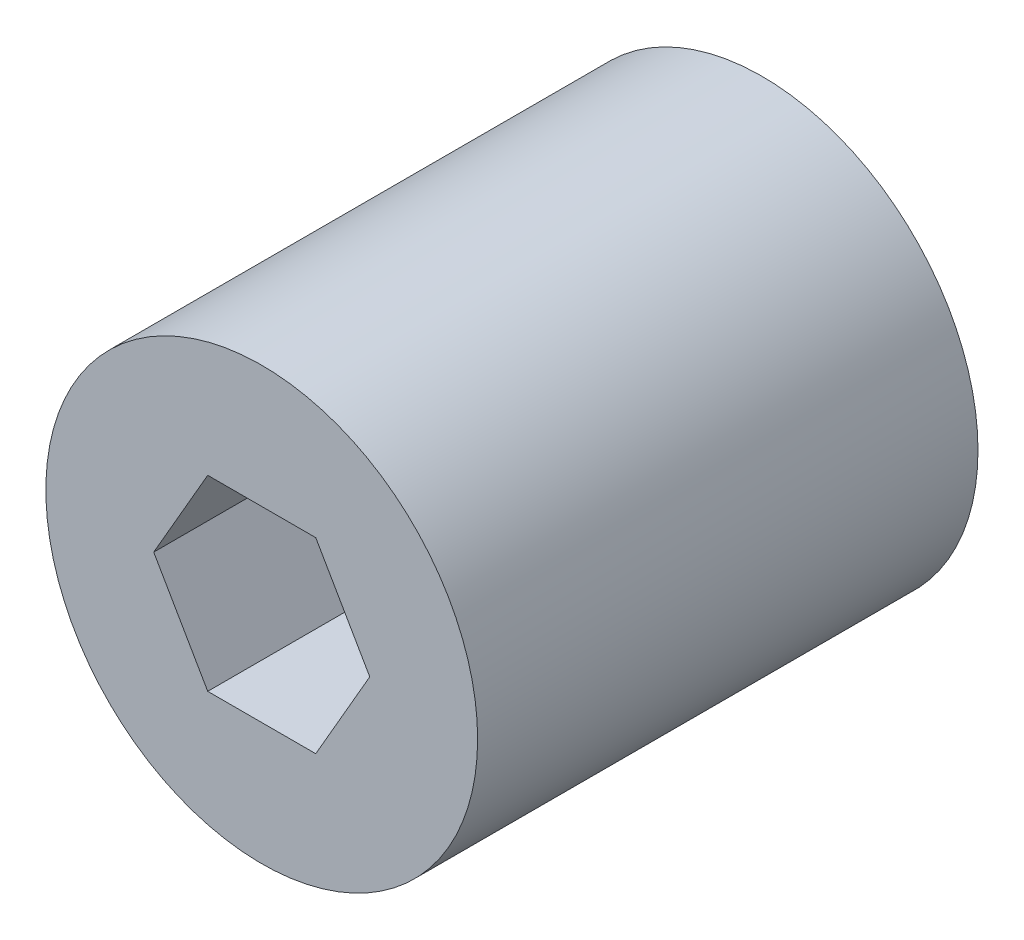
ISO-10303-21;
HEADER;
FILE_DESCRIPTION(('STEP AP214'),'2;1');
FILE_NAME('part.step','',(''),(''),'','','');
FILE_SCHEMA(('AUTOMOTIVE_DESIGN { 1 0 10303 214 1 1 1 1 }'));
ENDSEC;
DATA;
#1=APPLICATION_CONTEXT('core data for automotive mechanical design processes');
#2=APPLICATION_PROTOCOL_DEFINITION('international standard','automotive_design',2000,#1);
#3=PRODUCT_CONTEXT('',#1,'mechanical');
#4=PRODUCT('Part','Part','',(#3));
#5=PRODUCT_RELATED_PRODUCT_CATEGORY('part','',(#4));
#6=PRODUCT_DEFINITION_FORMATION('','',#4);
#7=PRODUCT_DEFINITION_CONTEXT('part definition',#1,'design');
#8=PRODUCT_DEFINITION('design','',#6,#7);
#9=PRODUCT_DEFINITION_SHAPE('','',#8);
#10=(LENGTH_UNIT() NAMED_UNIT(*) SI_UNIT(.MILLI.,.METRE.));
#11=(NAMED_UNIT(*) PLANE_ANGLE_UNIT() SI_UNIT($,.RADIAN.));
#12=(NAMED_UNIT(*) SI_UNIT($,.STERADIAN.) SOLID_ANGLE_UNIT());
#13=UNCERTAINTY_MEASURE_WITH_UNIT(LENGTH_MEASURE(1.E-05),#10,'distance_accuracy_value','');
#14=(GEOMETRIC_REPRESENTATION_CONTEXT(3) GLOBAL_UNCERTAINTY_ASSIGNED_CONTEXT((#13)) GLOBAL_UNIT_ASSIGNED_CONTEXT((#10,
#11,#12)) REPRESENTATION_CONTEXT('',''));
#15=CARTESIAN_POINT('',(0.,0.,0.));
#16=DIRECTION('',(0.,0.,1.));
#17=DIRECTION('',(1.,0.,0.));
#18=AXIS2_PLACEMENT_3D('',#15,#16,#17);
#19=CARTESIAN_POINT('',(0.,0.,13.90575));
#20=DIRECTION('',(0.,0.,1.));
#21=DIRECTION('',(1.,0.,0.));
#22=AXIS2_PLACEMENT_3D('',#19,#20,#21);
#23=PLANE('',#22);
#24=CARTESIAN_POINT('',(0.,0.,13.90575));
#25=DIRECTION('',(0.,0.,1.));
#26=DIRECTION('',(1.,0.,0.));
#27=AXIS2_PLACEMENT_3D('',#24,#25,#26);
#28=CIRCLE('',#27,6.);
#29=CARTESIAN_POINT('',(6.,0.,13.90575));
#30=VERTEX_POINT('',#29);
#31=EDGE_CURVE('E11',#30,#30,#28,.T.);
#32=ORIENTED_EDGE('',*,*,#31,.T.);
#33=EDGE_LOOP('',(#32));
#34=FACE_BOUND('',#33,.T.);
#35=DIRECTION('',(-0.5,0.866025403784439,0.));
#36=VECTOR('',#35,1.);
#37=CARTESIAN_POINT('',(3.00222139978606,0.,13.90575));
#38=LINE('',#37,#36);
#39=CARTESIAN_POINT('',(3.00222139978606,0.,13.90575));
#40=VERTEX_POINT('',#39);
#41=CARTESIAN_POINT('',(1.50111069989303,2.6,13.90575));
#42=VERTEX_POINT('',#41);
#43=EDGE_CURVE('E95',#40,#42,#38,.T.);
#44=ORIENTED_EDGE('',*,*,#43,.F.);
#45=DIRECTION('',(0.5,0.866025403784439,0.));
#46=VECTOR('',#45,1.);
#47=CARTESIAN_POINT('',(1.50111069989303,-2.6,13.90575));
#48=LINE('',#47,#46);
#49=CARTESIAN_POINT('',(1.50111069989303,-2.6,13.90575));
#50=VERTEX_POINT('',#49);
#51=EDGE_CURVE('E87',#50,#40,#48,.T.);
#52=ORIENTED_EDGE('',*,*,#51,.F.);
#53=DIRECTION('',(1.,0.,0.));
#54=VECTOR('',#53,1.);
#55=CARTESIAN_POINT('',(-1.50111069989303,-2.6,13.90575));
#56=LINE('',#55,#54);
#57=CARTESIAN_POINT('',(-1.50111069989303,-2.6,13.90575));
#58=VERTEX_POINT('',#57);
#59=EDGE_CURVE('E115',#58,#50,#56,.T.);
#60=ORIENTED_EDGE('',*,*,#59,.F.);
#61=DIRECTION('',(0.5,-0.866025403784439,0.));
#62=VECTOR('',#61,1.);
#63=CARTESIAN_POINT('',(-3.00222139978606,0.,13.90575));
#64=LINE('',#63,#62);
#65=CARTESIAN_POINT('',(-3.00222139978606,0.,13.90575));
#66=VERTEX_POINT('',#65);
#67=EDGE_CURVE('E113',#66,#58,#64,.T.);
#68=ORIENTED_EDGE('',*,*,#67,.F.);
#69=DIRECTION('',(-0.5,-0.866025403784439,0.));
#70=VECTOR('',#69,1.);
#71=CARTESIAN_POINT('',(-1.50111069989303,2.6,13.90575));
#72=LINE('',#71,#70);
#73=CARTESIAN_POINT('',(-1.50111069989303,2.6,13.90575));
#74=VERTEX_POINT('',#73);
#75=EDGE_CURVE('E109',#74,#66,#72,.T.);
#76=ORIENTED_EDGE('',*,*,#75,.F.);
#77=DIRECTION('',(-1.,0.,0.));
#78=VECTOR('',#77,1.);
#79=CARTESIAN_POINT('',(1.50111069989303,2.6,13.90575));
#80=LINE('',#79,#78);
#81=EDGE_CURVE('E107',#42,#74,#80,.T.);
#82=ORIENTED_EDGE('',*,*,#81,.F.);
#83=EDGE_LOOP('',(#44,#52,#60,#68,#76,#82));
#84=FACE_BOUND('',#83,.T.);
#85=ADVANCED_FACE('F34',(#34,#84),#23,.T.);
#86=CARTESIAN_POINT('',(0.,0.,0.));
#87=DIRECTION('',(0.,0.,1.));
#88=DIRECTION('',(1.,0.,0.));
#89=AXIS2_PLACEMENT_3D('',#86,#87,#88);
#90=PLANE('',#89);
#91=CARTESIAN_POINT('',(0.,0.,0.));
#92=DIRECTION('',(0.,0.,1.));
#93=DIRECTION('',(1.,0.,0.));
#94=AXIS2_PLACEMENT_3D('',#91,#92,#93);
#95=CIRCLE('',#94,6.);
#96=CARTESIAN_POINT('',(6.,0.,0.));
#97=VERTEX_POINT('',#96);
#98=EDGE_CURVE('E38',#97,#97,#95,.T.);
#99=ORIENTED_EDGE('',*,*,#98,.F.);
#100=EDGE_LOOP('',(#99));
#101=FACE_BOUND('',#100,.T.);
#102=DIRECTION('',(0.5,0.866025403784439,0.));
#103=VECTOR('',#102,1.);
#104=CARTESIAN_POINT('',(1.50111069989303,-2.6,0.));
#105=LINE('',#104,#103);
#106=CARTESIAN_POINT('',(1.50111069989303,-2.6,0.));
#107=VERTEX_POINT('',#106);
#108=CARTESIAN_POINT('',(3.00222139978606,0.,0.));
#109=VERTEX_POINT('',#108);
#110=EDGE_CURVE('E57',#107,#109,#105,.T.);
#111=ORIENTED_EDGE('',*,*,#110,.T.);
#112=DIRECTION('',(-0.5,0.866025403784439,0.));
#113=VECTOR('',#112,1.);
#114=CARTESIAN_POINT('',(3.00222139978606,0.,0.));
#115=LINE('',#114,#113);
#116=CARTESIAN_POINT('',(1.50111069989303,2.6,0.));
#117=VERTEX_POINT('',#116);
#118=EDGE_CURVE('E102',#109,#117,#115,.T.);
#119=ORIENTED_EDGE('',*,*,#118,.T.);
#120=DIRECTION('',(-1.,0.,0.));
#121=VECTOR('',#120,1.);
#122=CARTESIAN_POINT('',(1.50111069989303,2.6,0.));
#123=LINE('',#122,#121);
#124=CARTESIAN_POINT('',(-1.50111069989303,2.6,0.));
#125=VERTEX_POINT('',#124);
#126=EDGE_CURVE('E119',#117,#125,#123,.T.);
#127=ORIENTED_EDGE('',*,*,#126,.T.);
#128=DIRECTION('',(-0.5,-0.866025403784439,0.));
#129=VECTOR('',#128,1.);
#130=CARTESIAN_POINT('',(-1.50111069989303,2.6,0.));
#131=LINE('',#130,#129);
#132=CARTESIAN_POINT('',(-3.00222139978606,0.,0.));
#133=VERTEX_POINT('',#132);
#134=EDGE_CURVE('E122',#125,#133,#131,.T.);
#135=ORIENTED_EDGE('',*,*,#134,.T.);
#136=DIRECTION('',(0.5,-0.866025403784439,0.));
#137=VECTOR('',#136,1.);
#138=CARTESIAN_POINT('',(-3.00222139978606,0.,0.));
#139=LINE('',#138,#137);
#140=CARTESIAN_POINT('',(-1.50111069989303,-2.6,0.));
#141=VERTEX_POINT('',#140);
#142=EDGE_CURVE('E125',#133,#141,#139,.T.);
#143=ORIENTED_EDGE('',*,*,#142,.T.);
#144=DIRECTION('',(1.,0.,0.));
#145=VECTOR('',#144,1.);
#146=CARTESIAN_POINT('',(-1.50111069989303,-2.6,0.));
#147=LINE('',#146,#145);
#148=EDGE_CURVE('E96',#141,#107,#147,.T.);
#149=ORIENTED_EDGE('',*,*,#148,.T.);
#150=EDGE_LOOP('',(#111,#119,#127,#135,#143,#149));
#151=FACE_BOUND('',#150,.T.);
#152=ADVANCED_FACE('F142',(#101,#151),#90,.F.);
#153=CARTESIAN_POINT('',(0.,0.,13.90575));
#154=DIRECTION('',(0.,0.,-1.));
#155=DIRECTION('',(-1.,0.,0.));
#156=AXIS2_PLACEMENT_3D('',#153,#154,#155);
#157=CYLINDRICAL_SURFACE('',#156,6.);
#158=ORIENTED_EDGE('',*,*,#31,.F.);
#159=EDGE_LOOP('',(#158));
#160=FACE_BOUND('',#159,.T.);
#161=ORIENTED_EDGE('',*,*,#98,.T.);
#162=EDGE_LOOP('',(#161));
#163=FACE_BOUND('',#162,.T.);
#164=ADVANCED_FACE('F36',(#160,#163),#157,.T.);
#165=CARTESIAN_POINT('',(1.50111069989303,-2.6,13.90575));
#166=DIRECTION('',(-0.866025403784439,0.5,0.));
#167=DIRECTION('',(-0.5,-0.866025403784439,0.));
#168=AXIS2_PLACEMENT_3D('',#165,#166,#167);
#169=PLANE('',#168);
#170=ORIENTED_EDGE('',*,*,#110,.F.);
#171=DIRECTION('',(0.,0.,-1.));
#172=VECTOR('',#171,1.);
#173=CARTESIAN_POINT('',(1.50111069989303,-2.6,13.90575));
#174=LINE('',#173,#172);
#175=EDGE_CURVE('E91',#50,#107,#174,.T.);
#176=ORIENTED_EDGE('',*,*,#175,.F.);
#177=ORIENTED_EDGE('',*,*,#51,.T.);
#178=DIRECTION('',(0.,0.,-1.));
#179=VECTOR('',#178,1.);
#180=CARTESIAN_POINT('',(3.00222139978606,0.,13.90575));
#181=LINE('',#180,#179);
#182=EDGE_CURVE('E90',#40,#109,#181,.T.);
#183=ORIENTED_EDGE('',*,*,#182,.T.);
#184=EDGE_LOOP('',(#170,#176,#177,#183));
#185=FACE_BOUND('',#184,.T.);
#186=ADVANCED_FACE('F89',(#185),#169,.T.);
#187=CARTESIAN_POINT('',(3.00222139978606,0.,13.90575));
#188=DIRECTION('',(-0.866025403784439,-0.5,0.));
#189=DIRECTION('',(0.5,-0.866025403784439,0.));
#190=AXIS2_PLACEMENT_3D('',#187,#188,#189);
#191=PLANE('',#190);
#192=ORIENTED_EDGE('',*,*,#118,.F.);
#193=ORIENTED_EDGE('',*,*,#182,.F.);
#194=ORIENTED_EDGE('',*,*,#43,.T.);
#195=DIRECTION('',(0.,0.,-1.));
#196=VECTOR('',#195,1.);
#197=CARTESIAN_POINT('',(1.50111069989303,2.6,13.90575));
#198=LINE('',#197,#196);
#199=EDGE_CURVE('E103',#42,#117,#198,.T.);
#200=ORIENTED_EDGE('',*,*,#199,.T.);
#201=EDGE_LOOP('',(#192,#193,#194,#200));
#202=FACE_BOUND('',#201,.T.);
#203=ADVANCED_FACE('F99',(#202),#191,.T.);
#204=CARTESIAN_POINT('',(1.50111069989303,2.6,13.90575));
#205=DIRECTION('',(0.,-1.,0.));
#206=DIRECTION('',(1.,0.,0.));
#207=AXIS2_PLACEMENT_3D('',#204,#205,#206);
#208=PLANE('',#207);
#209=ORIENTED_EDGE('',*,*,#126,.F.);
#210=ORIENTED_EDGE('',*,*,#199,.F.);
#211=ORIENTED_EDGE('',*,*,#81,.T.);
#212=DIRECTION('',(0.,0.,-1.));
#213=VECTOR('',#212,1.);
#214=CARTESIAN_POINT('',(-1.50111069989303,2.6,13.90575));
#215=LINE('',#214,#213);
#216=EDGE_CURVE('E134',#74,#125,#215,.T.);
#217=ORIENTED_EDGE('',*,*,#216,.T.);
#218=EDGE_LOOP('',(#209,#210,#211,#217));
#219=FACE_BOUND('',#218,.T.);
#220=ADVANCED_FACE('F138',(#219),#208,.T.);
#221=CARTESIAN_POINT('',(-1.50111069989303,2.6,13.90575));
#222=DIRECTION('',(0.866025403784439,-0.5,0.));
#223=DIRECTION('',(0.5,0.866025403784439,0.));
#224=AXIS2_PLACEMENT_3D('',#221,#222,#223);
#225=PLANE('',#224);
#226=ORIENTED_EDGE('',*,*,#134,.F.);
#227=ORIENTED_EDGE('',*,*,#216,.F.);
#228=ORIENTED_EDGE('',*,*,#75,.T.);
#229=DIRECTION('',(0.,0.,-1.));
#230=VECTOR('',#229,1.);
#231=CARTESIAN_POINT('',(-3.00222139978606,0.,13.90575));
#232=LINE('',#231,#230);
#233=EDGE_CURVE('E132',#66,#133,#232,.T.);
#234=ORIENTED_EDGE('',*,*,#233,.T.);
#235=EDGE_LOOP('',(#226,#227,#228,#234));
#236=FACE_BOUND('',#235,.T.);
#237=ADVANCED_FACE('F150',(#236),#225,.T.);
#238=CARTESIAN_POINT('',(-3.00222139978606,0.,13.90575));
#239=DIRECTION('',(0.866025403784439,0.5,0.));
#240=DIRECTION('',(-0.5,0.866025403784439,0.));
#241=AXIS2_PLACEMENT_3D('',#238,#239,#240);
#242=PLANE('',#241);
#243=ORIENTED_EDGE('',*,*,#142,.F.);
#244=ORIENTED_EDGE('',*,*,#233,.F.);
#245=ORIENTED_EDGE('',*,*,#67,.T.);
#246=DIRECTION('',(0.,0.,-1.));
#247=VECTOR('',#246,1.);
#248=CARTESIAN_POINT('',(-1.50111069989303,-2.6,13.90575));
#249=LINE('',#248,#247);
#250=EDGE_CURVE('E49',#58,#141,#249,.T.);
#251=ORIENTED_EDGE('',*,*,#250,.T.);
#252=EDGE_LOOP('',(#243,#244,#245,#251));
#253=FACE_BOUND('',#252,.T.);
#254=ADVANCED_FACE('F148',(#253),#242,.T.);
#255=CARTESIAN_POINT('',(-1.50111069989303,-2.6,13.90575));
#256=DIRECTION('',(0.,1.,0.));
#257=DIRECTION('',(0.,0.,1.));
#258=AXIS2_PLACEMENT_3D('',#255,#256,#257);
#259=PLANE('',#258);
#260=ORIENTED_EDGE('',*,*,#148,.F.);
#261=ORIENTED_EDGE('',*,*,#250,.F.);
#262=ORIENTED_EDGE('',*,*,#59,.T.);
#263=ORIENTED_EDGE('',*,*,#175,.T.);
#264=EDGE_LOOP('',(#260,#261,#262,#263));
#265=FACE_BOUND('',#264,.T.);
#266=ADVANCED_FACE('F144',(#265),#259,.T.);
#267=CLOSED_SHELL('',(#85,#152,#164,#186,#203,#220,#237,#254,#266));
#268=MANIFOLD_SOLID_BREP('B2',#267);
#269=ADVANCED_BREP_SHAPE_REPRESENTATION('',(#18,#268),#14);
#270=SHAPE_DEFINITION_REPRESENTATION(#9,#269);
ENDSEC;
END-ISO-10303-21;
